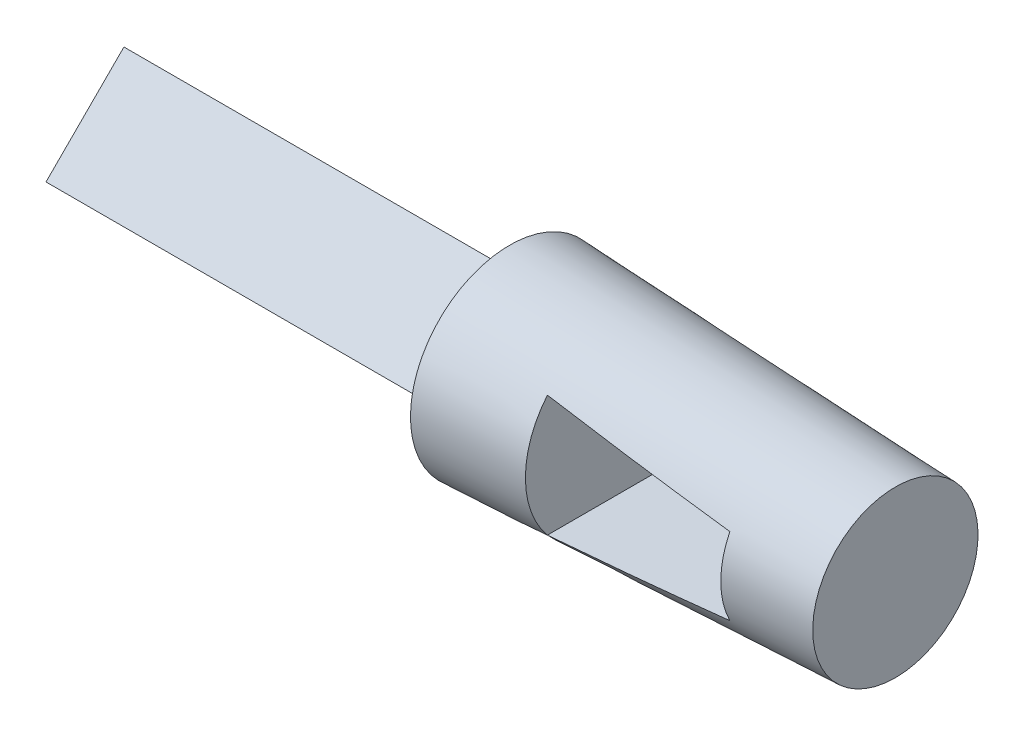
ISO-10303-21;
HEADER;
FILE_DESCRIPTION(('STEP AP214'),'2;1');
FILE_NAME('part.step','',(''),(''),'','','');
FILE_SCHEMA(('AUTOMOTIVE_DESIGN { 1 0 10303 214 1 1 1 1 }'));
ENDSEC;
DATA;
#1=APPLICATION_CONTEXT('core data for automotive mechanical design processes');
#2=APPLICATION_PROTOCOL_DEFINITION('international standard','automotive_design',2000,#1);
#3=PRODUCT_CONTEXT('',#1,'mechanical');
#4=PRODUCT('Part','Part','',(#3));
#5=PRODUCT_RELATED_PRODUCT_CATEGORY('part','',(#4));
#6=PRODUCT_DEFINITION_FORMATION('','',#4);
#7=PRODUCT_DEFINITION_CONTEXT('part definition',#1,'design');
#8=PRODUCT_DEFINITION('design','',#6,#7);
#9=PRODUCT_DEFINITION_SHAPE('','',#8);
#10=(LENGTH_UNIT() NAMED_UNIT(*) SI_UNIT(.MILLI.,.METRE.));
#11=(NAMED_UNIT(*) PLANE_ANGLE_UNIT() SI_UNIT($,.RADIAN.));
#12=(NAMED_UNIT(*) SI_UNIT($,.STERADIAN.) SOLID_ANGLE_UNIT());
#13=UNCERTAINTY_MEASURE_WITH_UNIT(LENGTH_MEASURE(1.E-05),#10,'distance_accuracy_value','');
#14=(GEOMETRIC_REPRESENTATION_CONTEXT(3) GLOBAL_UNCERTAINTY_ASSIGNED_CONTEXT((#13)) GLOBAL_UNIT_ASSIGNED_CONTEXT((#10,
#11,#12)) REPRESENTATION_CONTEXT('',''));
#15=CARTESIAN_POINT('',(0.,0.,0.));
#16=DIRECTION('',(0.,0.,1.));
#17=DIRECTION('',(1.,0.,0.));
#18=AXIS2_PLACEMENT_3D('',#15,#16,#17);
#19=CARTESIAN_POINT('',(70.,0.,0.));
#20=DIRECTION('',(-1.,0.,0.));
#21=DIRECTION('',(0.,-1.,0.));
#22=AXIS2_PLACEMENT_3D('',#19,#20,#21);
#23=PLANE('',#22);
#24=CARTESIAN_POINT('',(70.,0.,0.));
#25=DIRECTION('',(-1.,0.,0.));
#26=DIRECTION('',(0.,-1.,0.));
#27=AXIS2_PLACEMENT_3D('',#24,#25,#26);
#28=CIRCLE('',#27,7.5);
#29=CARTESIAN_POINT('',(70.,-7.5,0.));
#30=VERTEX_POINT('',#29);
#31=EDGE_CURVE('E93',#30,#30,#28,.T.);
#32=ORIENTED_EDGE('',*,*,#31,.F.);
#33=EDGE_LOOP('',(#32));
#34=FACE_BOUND('',#33,.T.);
#35=ADVANCED_FACE('F49',(#34),#23,.F.);
#36=CARTESIAN_POINT('',(70.,0.,0.));
#37=DIRECTION('',(-1.,0.,0.));
#38=DIRECTION('',(0.,-1.,0.));
#39=AXIS2_PLACEMENT_3D('',#36,#37,#38);
#40=CONICAL_SURFACE('',#39,7.5,0.0428309326687273);
#41=CARTESIAN_POINT('',(68.3013706688627,-2.75866227425144,0.));
#42=DIRECTION('',(-0.116841247567396,0.993150604322876,0.));
#43=DIRECTION('',(-0.993150604322876,-0.116841247567396,0.));
#44=AXIS2_PLACEMENT_3D('',#41,#42,#43);
#45=ELLIPSE('',#44,64.8127143245155,7.05245050051664);
#46=CARTESIAN_POINT('',(45.,-5.49999999999996,6.57414540112252));
#47=VERTEX_POINT('',#46);
#48=CARTESIAN_POINT('',(62.,-3.49999999999999,7.01857593556309));
#49=VERTEX_POINT('',#48);
#50=EDGE_CURVE('E57',#47,#49,#45,.T.);
#51=ORIENTED_EDGE('',*,*,#50,.F.);
#52=CARTESIAN_POINT('',(45.,0.,0.));
#53=DIRECTION('',(-1.,0.,0.));
#54=DIRECTION('',(0.,-1.,0.));
#55=AXIS2_PLACEMENT_3D('',#52,#53,#54);
#56=CIRCLE('',#55,8.57142857142857);
#57=CARTESIAN_POINT('',(45.,5.5,6.57414540112261));
#58=VERTEX_POINT('',#57);
#59=EDGE_CURVE('E12',#47,#58,#56,.T.);
#60=ORIENTED_EDGE('',*,*,#59,.T.);
#61=CARTESIAN_POINT('',(68.3013706688627,2.75866227425145,0.));
#62=DIRECTION('',(0.116841247567397,0.993150604322876,0.));
#63=DIRECTION('',(-0.993150604322876,0.116841247567397,0.));
#64=AXIS2_PLACEMENT_3D('',#61,#62,#63);
#65=ELLIPSE('',#64,64.8127143245168,7.05245050051671);
#66=CARTESIAN_POINT('',(62.,3.5,7.01857593556305));
#67=VERTEX_POINT('',#66);
#68=EDGE_CURVE('E95',#58,#67,#65,.T.);
#69=ORIENTED_EDGE('',*,*,#68,.T.);
#70=CARTESIAN_POINT('',(62.,0.,0.));
#71=DIRECTION('',(1.,0.,0.));
#72=DIRECTION('',(0.,0.,-1.));
#73=AXIS2_PLACEMENT_3D('',#70,#71,#72);
#74=CIRCLE('',#73,7.84285714285714);
#75=EDGE_CURVE('E101',#67,#49,#74,.T.);
#76=ORIENTED_EDGE('',*,*,#75,.T.);
#77=EDGE_LOOP('',(#51,#60,#69,#76));
#78=FACE_BOUND('',#77,.T.);
#79=CARTESIAN_POINT('',(62.,3.5,-7.01857593556306));
#80=VERTEX_POINT('',#79);
#81=CARTESIAN_POINT('',(45.,5.5,-6.57414540112262));
#82=VERTEX_POINT('',#81);
#83=EDGE_CURVE('E87',#80,#82,#65,.T.);
#84=ORIENTED_EDGE('',*,*,#83,.T.);
#85=CARTESIAN_POINT('',(45.,-5.49999999999996,-6.57414540112253));
#86=VERTEX_POINT('',#85);
#87=EDGE_CURVE('E52',#82,#86,#56,.T.);
#88=ORIENTED_EDGE('',*,*,#87,.T.);
#89=CARTESIAN_POINT('',(62.,-3.49999999999999,-7.0185759355631));
#90=VERTEX_POINT('',#89);
#91=EDGE_CURVE('E108',#90,#86,#45,.T.);
#92=ORIENTED_EDGE('',*,*,#91,.F.);
#93=EDGE_CURVE('E92',#90,#80,#74,.T.);
#94=ORIENTED_EDGE('',*,*,#93,.T.);
#95=EDGE_LOOP('',(#84,#88,#92,#94));
#96=FACE_BOUND('',#95,.T.);
#97=CARTESIAN_POINT('',(35.,0.,0.));
#98=DIRECTION('',(-1.,0.,0.));
#99=DIRECTION('',(0.,-1.,0.));
#100=AXIS2_PLACEMENT_3D('',#97,#98,#99);
#101=CIRCLE('',#100,9.);
#102=CARTESIAN_POINT('',(35.,-8.99999999999998,0.));
#103=VERTEX_POINT('',#102);
#104=EDGE_CURVE('E115',#103,#103,#101,.T.);
#105=ORIENTED_EDGE('',*,*,#104,.F.);
#106=EDGE_LOOP('',(#105));
#107=FACE_BOUND('',#106,.T.);
#108=ORIENTED_EDGE('',*,*,#31,.T.);
#109=EDGE_LOOP('',(#108));
#110=FACE_BOUND('',#109,.T.);
#111=ADVANCED_FACE('F106',(#78,#96,#107,#110),#40,.T.);
#112=CARTESIAN_POINT('',(35.,9.00000000000002,0.));
#113=DIRECTION('',(1.,0.,0.));
#114=DIRECTION('',(0.,1.,0.));
#115=AXIS2_PLACEMENT_3D('',#112,#113,#114);
#116=PLANE('',#115);
#117=ORIENTED_EDGE('',*,*,#104,.T.);
#118=EDGE_LOOP('',(#117));
#119=FACE_BOUND('',#118,.T.);
#120=ADVANCED_FACE('F128',(#119),#116,.F.);
#121=CARTESIAN_POINT('',(45.,-5.49999999999996,35.));
#122=DIRECTION('',(-1.,0.,0.));
#123=DIRECTION('',(0.,-1.,0.));
#124=AXIS2_PLACEMENT_3D('',#121,#122,#123);
#125=PLANE('',#124);
#126=DIRECTION('',(0.,0.,-1.));
#127=VECTOR('',#126,1.);
#128=CARTESIAN_POINT('',(45.,-5.49999999999996,35.));
#129=LINE('',#128,#127);
#130=EDGE_CURVE('E118',#47,#86,#129,.T.);
#131=ORIENTED_EDGE('',*,*,#130,.T.);
#132=ORIENTED_EDGE('',*,*,#87,.F.);
#133=DIRECTION('',(0.,0.,-1.));
#134=VECTOR('',#133,1.);
#135=CARTESIAN_POINT('',(45.,5.5,35.));
#136=LINE('',#135,#134);
#137=EDGE_CURVE('E69',#58,#82,#136,.T.);
#138=ORIENTED_EDGE('',*,*,#137,.F.);
#139=ORIENTED_EDGE('',*,*,#59,.F.);
#140=EDGE_LOOP('',(#131,#132,#138,#139));
#141=FACE_BOUND('',#140,.T.);
#142=ADVANCED_FACE('F124',(#141),#125,.F.);
#143=CARTESIAN_POINT('',(45.,-5.49999999999996,35.));
#144=DIRECTION('',(-0.116841247567396,0.993150604322876,0.));
#145=DIRECTION('',(-0.993150604322876,-0.116841247567396,0.));
#146=AXIS2_PLACEMENT_3D('',#143,#144,#145);
#147=PLANE('',#146);
#148=ORIENTED_EDGE('',*,*,#50,.T.);
#149=DIRECTION('',(0.,0.,-1.));
#150=VECTOR('',#149,1.);
#151=CARTESIAN_POINT('',(62.,-3.49999999999999,35.));
#152=LINE('',#151,#150);
#153=EDGE_CURVE('E103',#49,#90,#152,.T.);
#154=ORIENTED_EDGE('',*,*,#153,.T.);
#155=ORIENTED_EDGE('',*,*,#91,.T.);
#156=ORIENTED_EDGE('',*,*,#130,.F.);
#157=EDGE_LOOP('',(#148,#154,#155,#156));
#158=FACE_BOUND('',#157,.T.);
#159=ADVANCED_FACE('F126',(#158),#147,.T.);
#160=CARTESIAN_POINT('',(62.,3.5,35.));
#161=DIRECTION('',(1.,0.,0.));
#162=DIRECTION('',(0.,0.,-1.));
#163=AXIS2_PLACEMENT_3D('',#160,#161,#162);
#164=PLANE('',#163);
#165=DIRECTION('',(0.,0.,-1.));
#166=VECTOR('',#165,1.);
#167=CARTESIAN_POINT('',(62.,3.5,35.));
#168=LINE('',#167,#166);
#169=EDGE_CURVE('E64',#67,#80,#168,.T.);
#170=ORIENTED_EDGE('',*,*,#169,.T.);
#171=ORIENTED_EDGE('',*,*,#93,.F.);
#172=ORIENTED_EDGE('',*,*,#153,.F.);
#173=ORIENTED_EDGE('',*,*,#75,.F.);
#174=EDGE_LOOP('',(#170,#171,#172,#173));
#175=FACE_BOUND('',#174,.T.);
#176=ADVANCED_FACE('F97',(#175),#164,.F.);
#177=CARTESIAN_POINT('',(45.,5.5,35.));
#178=DIRECTION('',(0.116841247567397,0.993150604322876,0.));
#179=DIRECTION('',(-0.993150604322876,0.116841247567397,0.));
#180=AXIS2_PLACEMENT_3D('',#177,#178,#179);
#181=PLANE('',#180);
#182=ORIENTED_EDGE('',*,*,#137,.T.);
#183=ORIENTED_EDGE('',*,*,#83,.F.);
#184=ORIENTED_EDGE('',*,*,#169,.F.);
#185=ORIENTED_EDGE('',*,*,#68,.F.);
#186=EDGE_LOOP('',(#182,#183,#184,#185));
#187=FACE_BOUND('',#186,.T.);
#188=ADVANCED_FACE('F88',(#187),#181,.F.);
#189=CLOSED_SHELL('',(#35,#111,#120,#142,#159,#176,#188));
#190=MANIFOLD_SOLID_BREP('B2',#189);
#191=CARTESIAN_POINT('',(35.,0.,7.07106781186549));
#192=DIRECTION('',(0.,0.707106781186549,0.707106781186547));
#193=DIRECTION('',(0.,-0.707106781186547,0.707106781186549));
#194=AXIS2_PLACEMENT_3D('',#191,#192,#193);
#195=PLANE('',#194);
#196=DIRECTION('',(0.,0.707106781186546,-0.707106781186548));
#197=VECTOR('',#196,1.);
#198=CARTESIAN_POINT('',(0.,0.,7.07106781186549));
#199=LINE('',#198,#197);
#200=CARTESIAN_POINT('',(0.,0.,7.07106781186549));
#201=VERTEX_POINT('',#200);
#202=CARTESIAN_POINT('',(0.,7.07106781186549,0.));
#203=VERTEX_POINT('',#202);
#204=EDGE_CURVE('E264',#201,#203,#199,.T.);
#205=ORIENTED_EDGE('',*,*,#204,.F.);
#206=DIRECTION('',(-1.,0.,0.));
#207=VECTOR('',#206,1.);
#208=CARTESIAN_POINT('',(35.,0.,7.07106781186549));
#209=LINE('',#208,#207);
#210=CARTESIAN_POINT('',(35.,0.,7.07106781186549));
#211=VERTEX_POINT('',#210);
#212=EDGE_CURVE('E47',#211,#201,#209,.T.);
#213=ORIENTED_EDGE('',*,*,#212,.F.);
#214=DIRECTION('',(0.,0.707106781186546,-0.707106781186548));
#215=VECTOR('',#214,1.);
#216=CARTESIAN_POINT('',(35.,0.,7.07106781186549));
#217=LINE('',#216,#215);
#218=CARTESIAN_POINT('',(35.,7.07106781186549,0.));
#219=VERTEX_POINT('',#218);
#220=EDGE_CURVE('E281',#211,#219,#217,.T.);
#221=ORIENTED_EDGE('',*,*,#220,.T.);
#222=DIRECTION('',(-1.,0.,0.));
#223=VECTOR('',#222,1.);
#224=CARTESIAN_POINT('',(35.,7.07106781186549,0.));
#225=LINE('',#224,#223);
#226=EDGE_CURVE('E193',#219,#203,#225,.T.);
#227=ORIENTED_EDGE('',*,*,#226,.T.);
#228=EDGE_LOOP('',(#205,#213,#221,#227));
#229=FACE_BOUND('',#228,.T.);
#230=ADVANCED_FACE('F190',(#229),#195,.T.);
#231=CARTESIAN_POINT('',(35.,0.,7.07106781186549));
#232=DIRECTION('',(0.,0.707106781186547,-0.707106781186548));
#233=DIRECTION('',(0.,0.707106781186548,0.707106781186547));
#234=AXIS2_PLACEMENT_3D('',#231,#232,#233);
#235=PLANE('',#234);
#236=DIRECTION('',(0.,-0.707106781186548,-0.707106781186547));
#237=VECTOR('',#236,1.);
#238=CARTESIAN_POINT('',(0.,0.,7.07106781186549));
#239=LINE('',#238,#237);
#240=CARTESIAN_POINT('',(0.,-7.07106781186546,0.));
#241=VERTEX_POINT('',#240);
#242=EDGE_CURVE('E280',#201,#241,#239,.T.);
#243=ORIENTED_EDGE('',*,*,#242,.T.);
#244=DIRECTION('',(-1.,0.,0.));
#245=VECTOR('',#244,1.);
#246=CARTESIAN_POINT('',(35.,-7.07106781186546,0.));
#247=LINE('',#246,#245);
#248=CARTESIAN_POINT('',(35.,-7.07106781186546,0.));
#249=VERTEX_POINT('',#248);
#250=EDGE_CURVE('E199',#249,#241,#247,.T.);
#251=ORIENTED_EDGE('',*,*,#250,.F.);
#252=DIRECTION('',(0.,-0.707106781186548,-0.707106781186547));
#253=VECTOR('',#252,1.);
#254=CARTESIAN_POINT('',(35.,0.,7.07106781186549));
#255=LINE('',#254,#253);
#256=EDGE_CURVE('E275',#211,#249,#255,.T.);
#257=ORIENTED_EDGE('',*,*,#256,.F.);
#258=ORIENTED_EDGE('',*,*,#212,.T.);
#259=EDGE_LOOP('',(#243,#251,#257,#258));
#260=FACE_BOUND('',#259,.T.);
#261=ADVANCED_FACE('F257',(#260),#235,.F.);
#262=CARTESIAN_POINT('',(35.,0.,-7.07106781186546));
#263=DIRECTION('',(0.,-0.707106781186549,-0.707106781186547));
#264=DIRECTION('',(0.,0.707106781186546,-0.707106781186549));
#265=AXIS2_PLACEMENT_3D('',#262,#263,#264);
#266=PLANE('',#265);
#267=DIRECTION('',(0.,-0.707106781186547,0.707106781186549));
#268=VECTOR('',#267,1.);
#269=CARTESIAN_POINT('',(0.,0.,-7.07106781186546));
#270=LINE('',#269,#268);
#271=CARTESIAN_POINT('',(0.,0.,-7.07106781186546));
#272=VERTEX_POINT('',#271);
#273=EDGE_CURVE('E269',#272,#241,#270,.T.);
#274=ORIENTED_EDGE('',*,*,#273,.F.);
#275=DIRECTION('',(-1.,0.,0.));
#276=VECTOR('',#275,1.);
#277=CARTESIAN_POINT('',(35.,0.,-7.07106781186546));
#278=LINE('',#277,#276);
#279=CARTESIAN_POINT('',(35.,0.,-7.07106781186546));
#280=VERTEX_POINT('',#279);
#281=EDGE_CURVE('E283',#280,#272,#278,.T.);
#282=ORIENTED_EDGE('',*,*,#281,.F.);
#283=DIRECTION('',(0.,-0.707106781186547,0.707106781186549));
#284=VECTOR('',#283,1.);
#285=CARTESIAN_POINT('',(35.,0.,-7.07106781186546));
#286=LINE('',#285,#284);
#287=EDGE_CURVE('E284',#280,#249,#286,.T.);
#288=ORIENTED_EDGE('',*,*,#287,.T.);
#289=ORIENTED_EDGE('',*,*,#250,.T.);
#290=EDGE_LOOP('',(#274,#282,#288,#289));
#291=FACE_BOUND('',#290,.T.);
#292=ADVANCED_FACE('F261',(#291),#266,.T.);
#293=CARTESIAN_POINT('',(35.,7.07106781186549,0.));
#294=DIRECTION('',(0.,0.707106781186546,-0.707106781186549));
#295=DIRECTION('',(0.,0.707106781186549,0.707106781186546));
#296=AXIS2_PLACEMENT_3D('',#293,#294,#295);
#297=PLANE('',#296);
#298=DIRECTION('',(0.,-0.707106781186549,-0.707106781186546));
#299=VECTOR('',#298,1.);
#300=CARTESIAN_POINT('',(0.,7.07106781186549,0.));
#301=LINE('',#300,#299);
#302=EDGE_CURVE('E266',#203,#272,#301,.T.);
#303=ORIENTED_EDGE('',*,*,#302,.F.);
#304=ORIENTED_EDGE('',*,*,#226,.F.);
#305=DIRECTION('',(0.,-0.707106781186549,-0.707106781186546));
#306=VECTOR('',#305,1.);
#307=CARTESIAN_POINT('',(35.,7.07106781186549,0.));
#308=LINE('',#307,#306);
#309=EDGE_CURVE('E288',#219,#280,#308,.T.);
#310=ORIENTED_EDGE('',*,*,#309,.T.);
#311=ORIENTED_EDGE('',*,*,#281,.T.);
#312=EDGE_LOOP('',(#303,#304,#310,#311));
#313=FACE_BOUND('',#312,.T.);
#314=ADVANCED_FACE('F296',(#313),#297,.T.);
#315=CARTESIAN_POINT('',(35.,0.,0.));
#316=DIRECTION('',(-1.,0.,0.));
#317=DIRECTION('',(0.,0.,1.));
#318=AXIS2_PLACEMENT_3D('',#315,#316,#317);
#319=PLANE('',#318);
#320=ORIENTED_EDGE('',*,*,#220,.F.);
#321=ORIENTED_EDGE('',*,*,#256,.T.);
#322=ORIENTED_EDGE('',*,*,#287,.F.);
#323=ORIENTED_EDGE('',*,*,#309,.F.);
#324=EDGE_LOOP('',(#320,#321,#322,#323));
#325=FACE_BOUND('',#324,.T.);
#326=ADVANCED_FACE('F251',(#325),#319,.F.);
#327=CARTESIAN_POINT('',(0.,0.,0.));
#328=DIRECTION('',(-1.,0.,0.));
#329=DIRECTION('',(0.,0.,1.));
#330=AXIS2_PLACEMENT_3D('',#327,#328,#329);
#331=PLANE('',#330);
#332=ORIENTED_EDGE('',*,*,#204,.T.);
#333=ORIENTED_EDGE('',*,*,#302,.T.);
#334=ORIENTED_EDGE('',*,*,#273,.T.);
#335=ORIENTED_EDGE('',*,*,#242,.F.);
#336=EDGE_LOOP('',(#332,#333,#334,#335));
#337=FACE_BOUND('',#336,.T.);
#338=CARTESIAN_POINT('',(0.,0.,0.));
#339=DIRECTION('',(1.,0.,0.));
#340=DIRECTION('',(0.,1.,0.));
#341=AXIS2_PLACEMENT_3D('',#338,#339,#340);
#342=CIRCLE('',#341,2.49999999999999);
#343=CARTESIAN_POINT('',(0.,2.5,0.));
#344=VERTEX_POINT('',#343);
#345=EDGE_CURVE('E272',#344,#344,#342,.T.);
#346=ORIENTED_EDGE('',*,*,#345,.T.);
#347=EDGE_LOOP('',(#346));
#348=FACE_BOUND('',#347,.T.);
#349=ADVANCED_FACE('F242',(#337,#348),#331,.T.);
#350=CARTESIAN_POINT('',(13.443375672974,0.,0.));
#351=DIRECTION('',(-1.,0.,0.));
#352=DIRECTION('',(0.,-1.,0.));
#353=AXIS2_PLACEMENT_3D('',#350,#351,#352);
#354=CONICAL_SURFACE('',#353,0.,1.0471975511966);
#355=CARTESIAN_POINT('',(12.,0.,0.));
#356=DIRECTION('',(1.,0.,0.));
#357=DIRECTION('',(0.,1.,0.));
#358=AXIS2_PLACEMENT_3D('',#355,#356,#357);
#359=CIRCLE('',#358,2.49999999999998);
#360=CARTESIAN_POINT('',(12.,2.5,0.));
#361=VERTEX_POINT('',#360);
#362=EDGE_CURVE('E267',#361,#361,#359,.T.);
#363=ORIENTED_EDGE('',*,*,#362,.F.);
#364=EDGE_LOOP('',(#363));
#365=FACE_BOUND('',#364,.T.);
#366=CARTESIAN_POINT('',(13.443375672974,0.,0.));
#367=VERTEX_POINT('',#366);
#368=VERTEX_LOOP('',#367);
#369=FACE_BOUND('',#368,.T.);
#370=ADVANCED_FACE('F239',(#365,#369),#354,.F.);
#371=CARTESIAN_POINT('',(13.443375672974,0.,0.));
#372=DIRECTION('',(1.,0.,0.));
#373=DIRECTION('',(0.,1.,0.));
#374=AXIS2_PLACEMENT_3D('',#371,#372,#373);
#375=CYLINDRICAL_SURFACE('',#374,2.49999999999999);
#376=ORIENTED_EDGE('',*,*,#345,.F.);
#377=EDGE_LOOP('',(#376));
#378=FACE_BOUND('',#377,.T.);
#379=ORIENTED_EDGE('',*,*,#362,.T.);
#380=EDGE_LOOP('',(#379));
#381=FACE_BOUND('',#380,.T.);
#382=ADVANCED_FACE('F241',(#378,#381),#375,.F.);
#383=CLOSED_SHELL('',(#230,#261,#292,#314,#326,#349,#370,#382));
#384=MANIFOLD_SOLID_BREP('B6',#383);
#385=ADVANCED_BREP_SHAPE_REPRESENTATION('',(#18,#190,#384),#14);
#386=SHAPE_DEFINITION_REPRESENTATION(#9,#385);
ENDSEC;
END-ISO-10303-21;
